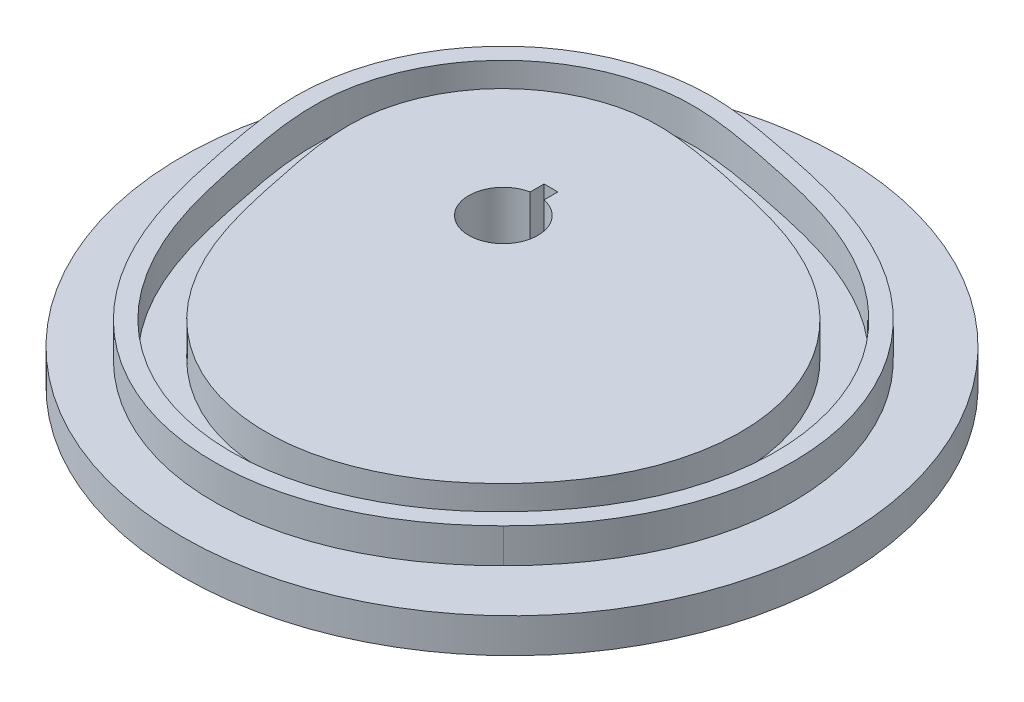
ISO-10303-21;
HEADER;
FILE_DESCRIPTION(('STEP AP214'),'2;1');
FILE_NAME('part.step','',(''),(''),'','','');
FILE_SCHEMA(('AUTOMOTIVE_DESIGN { 1 0 10303 214 1 1 1 1 }'));
ENDSEC;
DATA;
#1=APPLICATION_CONTEXT('core data for automotive mechanical design processes');
#2=APPLICATION_PROTOCOL_DEFINITION('international standard','automotive_design',2000,#1);
#3=PRODUCT_CONTEXT('',#1,'mechanical');
#4=PRODUCT('Part','Part','',(#3));
#5=PRODUCT_RELATED_PRODUCT_CATEGORY('part','',(#4));
#6=PRODUCT_DEFINITION_FORMATION('','',#4);
#7=PRODUCT_DEFINITION_CONTEXT('part definition',#1,'design');
#8=PRODUCT_DEFINITION('design','',#6,#7);
#9=PRODUCT_DEFINITION_SHAPE('','',#8);
#10=(LENGTH_UNIT() NAMED_UNIT(*) SI_UNIT(.MILLI.,.METRE.));
#11=(NAMED_UNIT(*) PLANE_ANGLE_UNIT() SI_UNIT($,.RADIAN.));
#12=(NAMED_UNIT(*) SI_UNIT($,.STERADIAN.) SOLID_ANGLE_UNIT());
#13=UNCERTAINTY_MEASURE_WITH_UNIT(LENGTH_MEASURE(1.E-05),#10,'distance_accuracy_value','');
#14=(GEOMETRIC_REPRESENTATION_CONTEXT(3) GLOBAL_UNCERTAINTY_ASSIGNED_CONTEXT((#13)) GLOBAL_UNIT_ASSIGNED_CONTEXT((#10,
#11,#12)) REPRESENTATION_CONTEXT('',''));
#15=CARTESIAN_POINT('',(0.,0.,0.));
#16=DIRECTION('',(0.,0.,1.));
#17=DIRECTION('',(1.,0.,0.));
#18=AXIS2_PLACEMENT_3D('',#15,#16,#17);
#19=CARTESIAN_POINT('',(-20.7250581944472,1.23780072465941,-19.2641218997697));
#20=DIRECTION('',(0.,-1.,0.));
#21=DIRECTION('',(0.,0.,-1.));
#22=AXIS2_PLACEMENT_3D('',#19,#20,#21);
#23=PLANE('',#22);
#24=CARTESIAN_POINT('',(-55.8573762406504,1.23780072465941,-47.3716739821013));
#25=CARTESIAN_POINT('',(-50.5288172543113,1.23780072465941,-54.0019546783824));
#26=CARTESIAN_POINT('',(-39.6443321368091,1.23780072465941,-61.6033613791305));
#27=CARTESIAN_POINT('',(-22.9455296145728,1.23780072465941,-64.8392255756643));
#28=CARTESIAN_POINT('',(-9.83633978596783,1.23780072465941,-63.4789217485952));
#29=CARTESIAN_POINT('',(3.99333035628244,1.23780072465941,-60.7481343562363));
#30=CARTESIAN_POINT('',(17.4797639447365,1.23780072465941,-57.7770866312036));
#31=CARTESIAN_POINT('',(30.2064835507659,1.23780072465941,-53.4467114583979));
#32=CARTESIAN_POINT('',(45.8009333534226,1.23780072465941,-45.082047008957));
#33=CARTESIAN_POINT('',(61.4665755023162,1.23780072465941,-29.2817178124764));
#34=CARTESIAN_POINT('',(69.8175879457047,1.23780072465941,-3.95976530659119));
#35=CARTESIAN_POINT('',(65.6963112235469,1.23780072465941,22.4072168115759));
#36=CARTESIAN_POINT('',(51.0610645872901,1.23780072465941,44.9503325048824));
#37=CARTESIAN_POINT('',(30.3169713478433,1.23780072465941,62.4762670891359));
#38=CARTESIAN_POINT('',(5.07456873277413,1.23780072465941,71.109606305069));
#39=CARTESIAN_POINT('',(-21.3476862192093,1.23780072465941,67.6188971319587));
#40=CARTESIAN_POINT('',(-43.2874386906402,1.23780072465941,52.4102403065771));
#41=CARTESIAN_POINT('',(-56.9879030358853,1.23780072465941,29.4282106690279));
#42=CARTESIAN_POINT('',(-61.8960006064018,1.23780072465941,7.02769018748866));
#43=CARTESIAN_POINT('',(-65.4801063005527,1.23780072465941,-11.3903444247296));
#44=CARTESIAN_POINT('',(-66.2871270685044,1.23780072465941,-28.4519578977249));
#45=CARTESIAN_POINT('',(-61.1859352269894,1.23780072465941,-40.7413932858202));
#46=CARTESIAN_POINT('',(-55.8573762406504,1.23780072465941,-47.3716739821013));
#47=B_SPLINE_CURVE_WITH_KNOTS('',3,(#24,#25,#26,#27,#28,#29,#30,#31,#32,#33,#34,#35,#36,#37,#38,
#39,#40,#41,#42,#43,#44,#45,#46),.UNSPECIFIED.,.T.,.F.,(4,1,1,1,1,1,1,1,1,1,1,1,1,1,1,1,1,1,1,1,
4),(0.,0.0625,0.09375,0.125,0.15625,0.1875,0.21875,0.25,0.3125,0.375,0.4375,0.5,0.5625,0.625,
0.6875,0.75,0.8125,0.875,0.90625,0.9375,1.),.UNSPECIFIED.);
#48=CARTESIAN_POINT('',(-55.8573762406504,1.23780072465941,-47.3716739821013));
#49=VERTEX_POINT('',#48);
#50=EDGE_CURVE('E175',#49,#49,#47,.T.);
#51=ORIENTED_EDGE('',*,*,#50,.T.);
#52=EDGE_LOOP('',(#51));
#53=FACE_BOUND('',#52,.T.);
#54=CARTESIAN_POINT('',(-63.6672689322955,1.23780072465941,-53.6171184134438));
#55=CARTESIAN_POINT('',(-60.4257884529088,1.23780072465941,-57.6723658103183));
#56=CARTESIAN_POINT('',(-52.7767211049436,1.23780072465941,-64.8578391651479));
#57=CARTESIAN_POINT('',(-38.7870135472323,1.23780072465941,-71.9917081712182));
#58=CARTESIAN_POINT('',(-23.2137298211832,1.23780072465941,-74.9720133366901));
#59=CARTESIAN_POINT('',(-7.95068138166864,1.23780072465941,-73.316095148756));
#60=CARTESIAN_POINT('',(5.90564366087613,1.23780072465941,-70.5591793768284));
#61=CARTESIAN_POINT('',(20.0463135567396,1.23780072465941,-67.4626850518113));
#62=CARTESIAN_POINT('',(34.1494743806365,1.23780072465941,-62.6868463988451));
#63=CARTESIAN_POINT('',(51.9164935761855,1.23780072465941,-53.1800784664138));
#64=CARTESIAN_POINT('',(70.2622313748988,1.23780072465941,-34.7751965527622));
#65=CARTESIAN_POINT('',(80.1834710229369,1.23780072465941,-4.76631506570023));
#66=CARTESIAN_POINT('',(75.2399592505119,1.23780072465941,26.2667730443286));
#67=CARTESIAN_POINT('',(58.5507531607223,1.23780072465941,51.7807343338891));
#68=CARTESIAN_POINT('',(35.6129040861121,1.23780072465941,71.2088752982963));
#69=CARTESIAN_POINT('',(6.18510752586127,1.23780072465941,81.4344301916235));
#70=CARTESIAN_POINT('',(-25.1240364963385,1.23780072465941,77.2900727309106));
#71=CARTESIAN_POINT('',(-50.9268980735882,1.23780072465941,59.3645963471125));
#72=CARTESIAN_POINT('',(-63.9416460527698,1.23780072465941,37.2683933707589));
#73=CARTESIAN_POINT('',(-69.6921720490184,1.23780072465941,18.3701491248002));
#74=CARTESIAN_POINT('',(-72.5906413542653,1.23780072465941,4.312052575006));
#75=CARTESIAN_POINT('',(-75.3784483597329,1.23780072465941,-9.64829344143936));
#76=CARTESIAN_POINT('',(-76.1880827818571,1.23780072465941,-25.2730793720674));
#77=CARTESIAN_POINT('',(-72.2256039812639,1.23780072465941,-40.5263547839013));
#78=CARTESIAN_POINT('',(-66.9087494116822,1.23780072465941,-49.5618710165694));
#79=CARTESIAN_POINT('',(-63.6672689322955,1.23780072465941,-53.6171184134438));
#80=B_SPLINE_CURVE_WITH_KNOTS('',3,(#54,#55,#56,#57,#58,#59,#60,#61,#62,#63,#64,#65,#66,#67,#68,
#69,#70,#71,#72,#73,#74,#75,#76,#77,#78,#79),.UNSPECIFIED.,.T.,.F.,(4,1,1,1,1,1,1,1,1,1,1,1,1,1,
1,1,1,1,1,1,1,1,1,4),(0.,0.03125,0.0625,0.09375,0.125,0.15625,0.1875,0.21875,0.25,0.3125,0.375,
0.4375,0.5,0.5625,0.625,0.6875,0.75,0.8125,0.84375,0.875,0.90625,0.9375,0.96875,1.),.UNSPECIFIED.);
#81=CARTESIAN_POINT('',(-63.6672689322955,1.23780072465941,-53.6171184134438));
#82=VERTEX_POINT('',#81);
#83=EDGE_CURVE('E12',#82,#82,#80,.T.);
#84=ORIENTED_EDGE('',*,*,#83,.F.);
#85=EDGE_LOOP('',(#84));
#86=FACE_BOUND('',#85,.T.);
#87=ADVANCED_FACE('F63',(#53,#86),#23,.F.);
#88=CARTESIAN_POINT('',(3.43251071316246,1.23780072465941,2.37590703520053));
#89=DIRECTION('',(0.,-1.,0.));
#90=DIRECTION('',(0.,0.,-1.));
#91=AXIS2_PLACEMENT_3D('',#88,#89,#90);
#92=CIRCLE('',#91,95.365062458421);
#93=CARTESIAN_POINT('',(3.43251071316246,1.23780072465941,-92.9891554232205));
#94=VERTEX_POINT('',#93);
#95=EDGE_CURVE('E150',#94,#94,#92,.T.);
#96=ORIENTED_EDGE('',*,*,#95,.F.);
#97=EDGE_LOOP('',(#96));
#98=FACE_BOUND('',#97,.T.);
#99=CARTESIAN_POINT('',(-80.7150310303877,1.23780072465941,-19.2636812561735));
#100=CARTESIAN_POINT('',(-80.7148535314178,1.23780072465941,-16.9970446042388));
#101=CARTESIAN_POINT('',(-80.4441279971398,1.23780072465941,-12.3706615965656));
#102=CARTESIAN_POINT('',(-79.2843035170772,1.23780072465941,-3.93414023687667));
#103=CARTESIAN_POINT('',(-77.4061341544626,1.23780072465941,5.80774853981868));
#104=CARTESIAN_POINT('',(-74.9485605393127,1.23780072465941,17.5781580749974));
#105=CARTESIAN_POINT('',(-70.4406813043361,1.23780072465941,33.8329774221332));
#106=CARTESIAN_POINT('',(-60.8712935701828,1.23780072465941,53.8723974444506));
#107=CARTESIAN_POINT('',(-41.5979186980638,1.23780072465941,73.3593792761598));
#108=CARTESIAN_POINT('',(-16.128440046319,1.23780072465941,84.5291520581967));
#109=CARTESIAN_POINT('',(11.6739887647436,1.23780072465941,85.0180298402957));
#110=CARTESIAN_POINT('',(32.9697362791022,1.23780072465941,77.0887083173432));
#111=CARTESIAN_POINT('',(47.5736861128552,1.23780072465941,67.2947859602535));
#112=CARTESIAN_POINT('',(54.0186959682644,1.23780072465941,61.562204852461));
#113=CARTESIAN_POINT('',(57.0729848136639,1.23780072465941,58.5074376105084));
#114=B_SPLINE_CURVE_WITH_KNOTS('',3,(#99,#100,#101,#102,#103,#104,#105,#106,#107,#108,#109,#110,
#111,#112,#113),.UNSPECIFIED.,.F.,.F.,(4,1,1,1,1,1,1,1,1,1,1,1,4),(0.0541157032648678,
0.0809874645350902,0.107859225805313,0.161602748345757,0.215346270886202,0.269089793426647,
0.376576838507537,0.484063883588426,0.591550928669316,0.699037973750205,0.806525018831095,
0.86026854137154,0.914012063911984),.UNSPECIFIED.);
#115=CARTESIAN_POINT('',(-80.7150310303877,1.23780072465941,-19.2636812561736));
#116=VERTEX_POINT('',#115);
#117=CARTESIAN_POINT('',(57.0729848136639,1.23780072465941,58.5074376105084));
#118=VERTEX_POINT('',#117);
#119=EDGE_CURVE('E149',#116,#118,#114,.T.);
#120=ORIENTED_EDGE('',*,*,#119,.F.);
#121=CARTESIAN_POINT('',(-20.7150324194709,1.23780072465941,-19.2644537324842));
#122=DIRECTION('',(0.,1.,0.));
#123=DIRECTION('',(0.,0.,1.));
#124=AXIS2_PLACEMENT_3D('',#121,#122,#123);
#125=CIRCLE('',#124,59.9999986158894);
#126=CARTESIAN_POINT('',(-20.7266995668747,1.23780072465941,-79.2644512140208));
#127=VERTEX_POINT('',#126);
#128=EDGE_CURVE('E85',#127,#116,#125,.T.);
#129=ORIENTED_EDGE('',*,*,#128,.F.);
#130=CARTESIAN_POINT('',(57.0729848136639,1.23780072465941,58.5074376105084));
#131=CARTESIAN_POINT('',(60.1271186952964,1.23780072465941,55.4525155527703));
#132=CARTESIAN_POINT('',(65.8583633113331,1.23780072465941,49.0063175100939));
#133=CARTESIAN_POINT('',(75.6492577840495,1.23780072465941,34.4003373803812));
#134=CARTESIAN_POINT('',(83.57416398284,1.23780072465941,13.1029464213755));
#135=CARTESIAN_POINT('',(83.0795221181748,1.23780072465941,-14.6993804639724));
#136=CARTESIAN_POINT('',(71.9044691310951,1.23780072465941,-40.1665428190488));
#137=CARTESIAN_POINT('',(52.4134918618961,1.23780072465941,-59.4358771635741));
#138=CARTESIAN_POINT('',(32.3720882809908,1.23780072465941,-69.0011100254117));
#139=CARTESIAN_POINT('',(16.1163346625905,1.23780072465941,-73.505619123593));
#140=CARTESIAN_POINT('',(4.3454158559125,1.23780072465941,-75.960752368452));
#141=CARTESIAN_POINT('',(-5.39686213767778,1.23780072465941,-77.8369019371807));
#142=CARTESIAN_POINT('',(-13.8336237076577,1.23780072465941,-78.9949772791908));
#143=CARTESIAN_POINT('',(-18.4600628802186,1.23780072465941,-79.2647436501834));
#144=CARTESIAN_POINT('',(-20.7266995668747,1.23780072465941,-79.2644512140208));
#145=B_SPLINE_CURVE_WITH_KNOTS('',3,(#130,#131,#132,#133,#134,#135,#136,#137,#138,#139,#140,
#141,#142,#143,#144),.UNSPECIFIED.,.F.,.F.,(4,1,1,1,1,1,1,1,1,1,1,1,4),(0.0541157038282967,
0.107859226398935,0.161602748969573,0.26908979411085,0.376576839252127,0.484063884393404,
0.591550929534681,0.699037974675958,0.752781497246596,0.806525019817235,0.860268542387873,
0.887140303673193,0.914012064958512),.UNSPECIFIED.);
#146=EDGE_CURVE('E81',#118,#127,#145,.T.);
#147=ORIENTED_EDGE('',*,*,#146,.F.);
#148=EDGE_LOOP('',(#120,#129,#147));
#149=FACE_BOUND('',#148,.T.);
#150=ADVANCED_FACE('F248',(#98,#149),#23,.F.);
#151=CARTESIAN_POINT('',(-20.7150324194709,11.2378007246594,-19.2644537324842));
#152=DIRECTION('',(0.,-1.,0.));
#153=DIRECTION('',(0.,0.,-1.));
#154=AXIS2_PLACEMENT_3D('',#151,#152,#153);
#155=CYLINDRICAL_SURFACE('',#154,10.);
#156=DIRECTION('',(0.,-1.,0.));
#157=VECTOR('',#156,1.);
#158=CARTESIAN_POINT('',(-18.7250581944472,11.2378007246594,-29.0644538643077));
#159=LINE('',#158,#157);
#160=CARTESIAN_POINT('',(-18.7250581944472,11.2378007246594,-29.0644538643077));
#161=VERTEX_POINT('',#160);
#162=CARTESIAN_POINT('',(-18.7250581944472,-8.76219927534059,-29.0644538643077));
#163=VERTEX_POINT('',#162);
#164=EDGE_CURVE('E199',#161,#163,#159,.T.);
#165=ORIENTED_EDGE('',*,*,#164,.T.);
#166=CARTESIAN_POINT('',(-20.7150324194709,-8.76219927534059,-19.2644537324842));
#167=DIRECTION('',(0.,-1.,0.));
#168=DIRECTION('',(0.,0.,-1.));
#169=AXIS2_PLACEMENT_3D('',#166,#167,#168);
#170=CIRCLE('',#169,10.);
#171=CARTESIAN_POINT('',(-22.7720412281136,-8.76219927534059,-29.050602860776));
#172=VERTEX_POINT('',#171);
#173=EDGE_CURVE('E164',#172,#163,#170,.F.);
#174=ORIENTED_EDGE('',*,*,#173,.F.);
#175=DIRECTION('',(0.,-1.,0.));
#176=VECTOR('',#175,1.);
#177=CARTESIAN_POINT('',(-22.7720412281136,11.2378007246594,-29.050602860776));
#178=LINE('',#177,#176);
#179=CARTESIAN_POINT('',(-22.7720412281136,11.2378007246594,-29.050602860776));
#180=VERTEX_POINT('',#179);
#181=EDGE_CURVE('E74',#180,#172,#178,.T.);
#182=ORIENTED_EDGE('',*,*,#181,.F.);
#183=CARTESIAN_POINT('',(-20.7150324194709,11.2378007246594,-19.2644537324842));
#184=DIRECTION('',(0.,1.,0.));
#185=DIRECTION('',(0.,0.,1.));
#186=AXIS2_PLACEMENT_3D('',#183,#184,#185);
#187=CIRCLE('',#186,10.);
#188=EDGE_CURVE('E182',#180,#161,#187,.T.);
#189=ORIENTED_EDGE('',*,*,#188,.T.);
#190=EDGE_LOOP('',(#165,#174,#182,#189));
#191=FACE_BOUND('',#190,.T.);
#192=ADVANCED_FACE('F221',(#191),#155,.F.);
#193=CARTESIAN_POINT('',(-22.7582269677878,11.2378007246594,-29.053471970831));
#194=DIRECTION('',(-0.20335231448665,0.,-0.979105630763567));
#195=DIRECTION('',(-0.979105630763567,0.,0.203352314486651));
#196=AXIS2_PLACEMENT_3D('',#193,#194,#195);
#197=PLANE('',#196);
#198=ORIENTED_EDGE('',*,*,#181,.T.);
#199=DIRECTION('',(-0.979105630763567,0.,0.20335231448665));
#200=VECTOR('',#199,1.);
#201=CARTESIAN_POINT('',(-22.7582269677878,-8.76219927534059,-29.053471970831));
#202=LINE('',#201,#200);
#203=CARTESIAN_POINT('',(-22.7250581944472,-8.76219927534059,-29.060360856581));
#204=VERTEX_POINT('',#203);
#205=EDGE_CURVE('E161',#204,#172,#202,.T.);
#206=ORIENTED_EDGE('',*,*,#205,.F.);
#207=DIRECTION('',(0.,-1.,0.));
#208=VECTOR('',#207,1.);
#209=CARTESIAN_POINT('',(-22.7250581944472,11.2378007246594,-29.060360856581));
#210=LINE('',#209,#208);
#211=CARTESIAN_POINT('',(-22.7250581944472,11.2378007246594,-29.060360856581));
#212=VERTEX_POINT('',#211);
#213=EDGE_CURVE('E212',#212,#204,#210,.T.);
#214=ORIENTED_EDGE('',*,*,#213,.F.);
#215=DIRECTION('',(0.979105630763567,0.,-0.203352314486651));
#216=VECTOR('',#215,1.);
#217=CARTESIAN_POINT('',(-22.7582269677878,11.2378007246594,-29.053471970831));
#218=LINE('',#217,#216);
#219=EDGE_CURVE('E188',#180,#212,#218,.T.);
#220=ORIENTED_EDGE('',*,*,#219,.F.);
#221=EDGE_LOOP('',(#198,#206,#214,#220));
#222=FACE_BOUND('',#221,.T.);
#223=ADVANCED_FACE('F217',(#222),#197,.F.);
#224=CARTESIAN_POINT('',(-22.7250581944472,11.2378007246594,-19.2641218997697));
#225=DIRECTION('',(-1.,0.,0.));
#226=DIRECTION('',(0.,0.,1.));
#227=AXIS2_PLACEMENT_3D('',#224,#225,#226);
#228=PLANE('',#227);
#229=ORIENTED_EDGE('',*,*,#213,.T.);
#230=DIRECTION('',(0.,0.,1.));
#231=VECTOR('',#230,1.);
#232=CARTESIAN_POINT('',(-22.7250581944472,-8.76219927534059,-19.2641218997697));
#233=LINE('',#232,#231);
#234=CARTESIAN_POINT('',(-22.7250581944472,-8.76219927534059,-33.060360856581));
#235=VERTEX_POINT('',#234);
#236=EDGE_CURVE('E173',#235,#204,#233,.T.);
#237=ORIENTED_EDGE('',*,*,#236,.F.);
#238=DIRECTION('',(0.,-1.,0.));
#239=VECTOR('',#238,1.);
#240=CARTESIAN_POINT('',(-22.7250581944472,11.2378007246594,-33.060360856581));
#241=LINE('',#240,#239);
#242=CARTESIAN_POINT('',(-22.7250581944472,11.2378007246594,-33.060360856581));
#243=VERTEX_POINT('',#242);
#244=EDGE_CURVE('E210',#243,#235,#241,.T.);
#245=ORIENTED_EDGE('',*,*,#244,.F.);
#246=DIRECTION('',(0.,0.,-1.));
#247=VECTOR('',#246,1.);
#248=CARTESIAN_POINT('',(-22.7250581944472,11.2378007246594,-19.2641218997697));
#249=LINE('',#248,#247);
#250=EDGE_CURVE('E191',#212,#243,#249,.T.);
#251=ORIENTED_EDGE('',*,*,#250,.F.);
#252=EDGE_LOOP('',(#229,#237,#245,#251));
#253=FACE_BOUND('',#252,.T.);
#254=ADVANCED_FACE('F229',(#253),#228,.F.);
#255=CARTESIAN_POINT('',(-20.7250581944472,11.2378007246594,-33.060360856581));
#256=DIRECTION('',(0.,0.,-1.));
#257=DIRECTION('',(-1.,0.,0.));
#258=AXIS2_PLACEMENT_3D('',#255,#256,#257);
#259=PLANE('',#258);
#260=ORIENTED_EDGE('',*,*,#244,.T.);
#261=DIRECTION('',(-1.,0.,0.));
#262=VECTOR('',#261,1.);
#263=CARTESIAN_POINT('',(-20.7250581944472,-8.76219927534059,-33.060360856581));
#264=LINE('',#263,#262);
#265=CARTESIAN_POINT('',(-18.7250581944472,-8.76219927534059,-33.060360856581));
#266=VERTEX_POINT('',#265);
#267=EDGE_CURVE('E170',#266,#235,#264,.T.);
#268=ORIENTED_EDGE('',*,*,#267,.F.);
#269=DIRECTION('',(0.,-1.,0.));
#270=VECTOR('',#269,1.);
#271=CARTESIAN_POINT('',(-18.7250581944472,11.2378007246594,-33.060360856581));
#272=LINE('',#271,#270);
#273=CARTESIAN_POINT('',(-18.7250581944472,11.2378007246594,-33.060360856581));
#274=VERTEX_POINT('',#273);
#275=EDGE_CURVE('E208',#274,#266,#272,.T.);
#276=ORIENTED_EDGE('',*,*,#275,.F.);
#277=DIRECTION('',(1.,0.,0.));
#278=VECTOR('',#277,1.);
#279=CARTESIAN_POINT('',(-20.7250581944472,11.2378007246594,-33.060360856581));
#280=LINE('',#279,#278);
#281=EDGE_CURVE('E194',#243,#274,#280,.T.);
#282=ORIENTED_EDGE('',*,*,#281,.F.);
#283=EDGE_LOOP('',(#260,#268,#276,#282));
#284=FACE_BOUND('',#283,.T.);
#285=ADVANCED_FACE('F237',(#284),#259,.F.);
#286=CARTESIAN_POINT('',(-55.8573762406504,11.2378007246594,-47.3716739821013));
#287=CARTESIAN_POINT('',(-50.5288172543113,11.2378007246594,-54.0019546783824));
#288=CARTESIAN_POINT('',(-39.6443321368091,11.2378007246594,-61.6033613791305));
#289=CARTESIAN_POINT('',(-22.9455296145728,11.2378007246594,-64.8392255756643));
#290=CARTESIAN_POINT('',(-9.83633978596783,11.2378007246594,-63.4789217485952));
#291=CARTESIAN_POINT('',(3.99333035628244,11.2378007246594,-60.7481343562363));
#292=CARTESIAN_POINT('',(17.4797639447365,11.2378007246594,-57.7770866312036));
#293=CARTESIAN_POINT('',(30.2064835507659,11.2378007246594,-53.4467114583979));
#294=CARTESIAN_POINT('',(45.8009333534226,11.2378007246594,-45.082047008957));
#295=CARTESIAN_POINT('',(61.4665755023162,11.2378007246594,-29.2817178124764));
#296=CARTESIAN_POINT('',(69.8175879457047,11.2378007246594,-3.95976530659119));
#297=CARTESIAN_POINT('',(65.6963112235469,11.2378007246594,22.4072168115759));
#298=CARTESIAN_POINT('',(51.0610645872901,11.2378007246594,44.9503325048824));
#299=CARTESIAN_POINT('',(30.3169713478433,11.2378007246594,62.4762670891359));
#300=CARTESIAN_POINT('',(5.07456873277413,11.2378007246594,71.109606305069));
#301=CARTESIAN_POINT('',(-21.3476862192093,11.2378007246594,67.6188971319587));
#302=CARTESIAN_POINT('',(-43.2874386906402,11.2378007246594,52.4102403065771));
#303=CARTESIAN_POINT('',(-56.9879030358853,11.2378007246594,29.4282106690279));
#304=CARTESIAN_POINT('',(-61.8960006064018,11.2378007246594,7.02769018748866));
#305=CARTESIAN_POINT('',(-65.4801063005527,11.2378007246594,-11.3903444247296));
#306=CARTESIAN_POINT('',(-66.2871270685044,11.2378007246594,-28.4519578977249));
#307=CARTESIAN_POINT('',(-61.1859352269894,11.2378007246594,-40.7413932858202));
#308=CARTESIAN_POINT('',(-55.8573762406504,11.2378007246594,-47.3716739821013));
#309=B_SPLINE_CURVE_WITH_KNOTS('',3,(#286,#287,#288,#289,#290,#291,#292,#293,#294,#295,#296,
#297,#298,#299,#300,#301,#302,#303,#304,#305,#306,#307,#308),.UNSPECIFIED.,.T.,.F.,(4,1,1,1,1,1,
1,1,1,1,1,1,1,1,1,1,1,1,1,1,4),(0.,0.0625,0.09375,0.125,0.15625,0.1875,0.21875,0.25,0.3125,
0.375,0.4375,0.5,0.5625,0.625,0.6875,0.75,0.8125,0.875,0.90625,0.9375,1.),.UNSPECIFIED.);
#310=DIRECTION('',(0.,-1.,0.));
#311=VECTOR('',#310,1.);
#312=SURFACE_OF_LINEAR_EXTRUSION('',#309,#311);
#313=CARTESIAN_POINT('',(-55.8573762406504,11.2378007246594,-47.3716739821013));
#314=VERTEX_POINT('',#313);
#315=EDGE_CURVE('E176',#314,#314,#309,.T.);
#316=ORIENTED_EDGE('',*,*,#315,.T.);
#317=EDGE_LOOP('',(#316));
#318=FACE_BOUND('',#317,.T.);
#319=ORIENTED_EDGE('',*,*,#50,.F.);
#320=EDGE_LOOP('',(#319));
#321=FACE_BOUND('',#320,.T.);
#322=ADVANCED_FACE('F65',(#318,#321),#312,.T.);
#323=CARTESIAN_POINT('',(-18.7250581944472,11.2378007246594,-19.2641218997697));
#324=DIRECTION('',(-1.,0.,0.));
#325=DIRECTION('',(0.,0.,1.));
#326=AXIS2_PLACEMENT_3D('',#323,#324,#325);
#327=PLANE('',#326);
#328=ORIENTED_EDGE('',*,*,#275,.T.);
#329=DIRECTION('',(0.,0.,-1.));
#330=VECTOR('',#329,1.);
#331=CARTESIAN_POINT('',(-18.7250581944472,-8.76219927534059,-19.2641218997697));
#332=LINE('',#331,#330);
#333=EDGE_CURVE('E167',#163,#266,#332,.T.);
#334=ORIENTED_EDGE('',*,*,#333,.F.);
#335=ORIENTED_EDGE('',*,*,#164,.F.);
#336=DIRECTION('',(0.,0.,-1.));
#337=VECTOR('',#336,1.);
#338=CARTESIAN_POINT('',(-18.7250581944472,11.2378007246594,-19.2641218997697));
#339=LINE('',#338,#337);
#340=EDGE_CURVE('E196',#161,#274,#339,.T.);
#341=ORIENTED_EDGE('',*,*,#340,.T.);
#342=EDGE_LOOP('',(#328,#334,#335,#341));
#343=FACE_BOUND('',#342,.T.);
#344=ADVANCED_FACE('F235',(#343),#327,.T.);
#345=CARTESIAN_POINT('',(-20.7250581944472,11.2378007246594,-19.2641218997697));
#346=DIRECTION('',(0.,1.,0.));
#347=DIRECTION('',(0.,0.,1.));
#348=AXIS2_PLACEMENT_3D('',#345,#346,#347);
#349=PLANE('',#348);
#350=ORIENTED_EDGE('',*,*,#315,.F.);
#351=EDGE_LOOP('',(#350));
#352=FACE_BOUND('',#351,.T.);
#353=ORIENTED_EDGE('',*,*,#188,.F.);
#354=ORIENTED_EDGE('',*,*,#219,.T.);
#355=ORIENTED_EDGE('',*,*,#250,.T.);
#356=ORIENTED_EDGE('',*,*,#281,.T.);
#357=ORIENTED_EDGE('',*,*,#340,.F.);
#358=EDGE_LOOP('',(#353,#354,#355,#356,#357));
#359=FACE_BOUND('',#358,.T.);
#360=ADVANCED_FACE('F231',(#352,#359),#349,.T.);
#361=CARTESIAN_POINT('',(3.43251071316246,-8.76219927534059,2.37590703520053));
#362=DIRECTION('',(0.,1.,0.));
#363=DIRECTION('',(0.,0.,1.));
#364=AXIS2_PLACEMENT_3D('',#361,#362,#363);
#365=CYLINDRICAL_SURFACE('',#364,95.365062458421);
#366=CARTESIAN_POINT('',(3.43251071316246,-8.76219927534059,2.37590703520053));
#367=DIRECTION('',(0.,-1.,0.));
#368=DIRECTION('',(0.,0.,-1.));
#369=AXIS2_PLACEMENT_3D('',#366,#367,#368);
#370=CIRCLE('',#369,95.365062458421);
#371=CARTESIAN_POINT('',(3.43251071316246,-8.76219927534059,-92.9891554232205));
#372=VERTEX_POINT('',#371);
#373=EDGE_CURVE('E153',#372,#372,#370,.T.);
#374=ORIENTED_EDGE('',*,*,#373,.F.);
#375=EDGE_LOOP('',(#374));
#376=FACE_BOUND('',#375,.T.);
#377=ORIENTED_EDGE('',*,*,#95,.T.);
#378=EDGE_LOOP('',(#377));
#379=FACE_BOUND('',#378,.T.);
#380=ADVANCED_FACE('F259',(#376,#379),#365,.T.);
#381=CARTESIAN_POINT('',(-20.7250581944472,-8.76219927534059,-19.2641218997697));
#382=DIRECTION('',(0.,-1.,0.));
#383=DIRECTION('',(0.,0.,-1.));
#384=AXIS2_PLACEMENT_3D('',#381,#382,#383);
#385=PLANE('',#384);
#386=ORIENTED_EDGE('',*,*,#373,.T.);
#387=EDGE_LOOP('',(#386));
#388=FACE_BOUND('',#387,.T.);
#389=ORIENTED_EDGE('',*,*,#205,.T.);
#390=ORIENTED_EDGE('',*,*,#173,.T.);
#391=ORIENTED_EDGE('',*,*,#333,.T.);
#392=ORIENTED_EDGE('',*,*,#267,.T.);
#393=ORIENTED_EDGE('',*,*,#236,.T.);
#394=EDGE_LOOP('',(#389,#390,#391,#392,#393));
#395=FACE_BOUND('',#394,.T.);
#396=ADVANCED_FACE('F224',(#388,#395),#385,.T.);
#397=CARTESIAN_POINT('',(-80.7150310303877,11.2378007246594,-19.2636812561735));
#398=CARTESIAN_POINT('',(-80.7148535314178,11.2378007246594,-16.9970446042388));
#399=CARTESIAN_POINT('',(-80.4441279971398,11.2378007246594,-12.3706615965656));
#400=CARTESIAN_POINT('',(-79.2843035170772,11.2378007246594,-3.93414023687667));
#401=CARTESIAN_POINT('',(-77.4061341544626,11.2378007246594,5.80774853981868));
#402=CARTESIAN_POINT('',(-74.9485605393127,11.2378007246594,17.5781580749974));
#403=CARTESIAN_POINT('',(-70.4406813043361,11.2378007246594,33.8329774221332));
#404=CARTESIAN_POINT('',(-60.8712935701828,11.2378007246594,53.8723974444506));
#405=CARTESIAN_POINT('',(-41.5979186980638,11.2378007246594,73.3593792761598));
#406=CARTESIAN_POINT('',(-16.128440046319,11.2378007246594,84.5291520581967));
#407=CARTESIAN_POINT('',(11.6739887647436,11.2378007246594,85.0180298402957));
#408=CARTESIAN_POINT('',(32.9697362791022,11.2378007246594,77.0887083173432));
#409=CARTESIAN_POINT('',(47.5736861128552,11.2378007246594,67.2947859602535));
#410=CARTESIAN_POINT('',(54.0186959682644,11.2378007246594,61.562204852461));
#411=CARTESIAN_POINT('',(57.0729848136639,11.2378007246594,58.5074376105084));
#412=B_SPLINE_CURVE_WITH_KNOTS('',3,(#397,#398,#399,#400,#401,#402,#403,#404,#405,#406,#407,
#408,#409,#410,#411),.UNSPECIFIED.,.F.,.F.,(4,1,1,1,1,1,1,1,1,1,1,1,4),(0.0541157032648678,
0.0809874645350902,0.107859225805313,0.161602748345757,0.215346270886202,0.269089793426647,
0.376576838507537,0.484063883588426,0.591550928669316,0.699037973750205,0.806525018831095,
0.86026854137154,0.914012063911984),.UNSPECIFIED.);
#413=DIRECTION('',(0.,-1.,0.));
#414=VECTOR('',#413,1.);
#415=SURFACE_OF_LINEAR_EXTRUSION('',#412,#414);
#416=ORIENTED_EDGE('',*,*,#119,.T.);
#417=DIRECTION('',(0.,-1.,0.));
#418=VECTOR('',#417,1.);
#419=CARTESIAN_POINT('',(57.0729848136639,11.2378007246594,58.5074376105084));
#420=LINE('',#419,#418);
#421=CARTESIAN_POINT('',(57.0729848136639,11.2378007246594,58.5074376105084));
#422=VERTEX_POINT('',#421);
#423=EDGE_CURVE('E132',#422,#118,#420,.T.);
#424=ORIENTED_EDGE('',*,*,#423,.F.);
#425=CARTESIAN_POINT('',(-80.7150310303877,11.2378007246594,-19.2636812561736));
#426=VERTEX_POINT('',#425);
#427=EDGE_CURVE('E139',#426,#422,#412,.T.);
#428=ORIENTED_EDGE('',*,*,#427,.F.);
#429=DIRECTION('',(0.,-1.,0.));
#430=VECTOR('',#429,1.);
#431=CARTESIAN_POINT('',(-80.7150310303877,11.2378007246594,-19.2636812561736));
#432=LINE('',#431,#430);
#433=EDGE_CURVE('E155',#426,#116,#432,.T.);
#434=ORIENTED_EDGE('',*,*,#433,.T.);
#435=EDGE_LOOP('',(#416,#424,#428,#434));
#436=FACE_BOUND('',#435,.T.);
#437=ADVANCED_FACE('F148',(#436),#415,.F.);
#438=CARTESIAN_POINT('',(57.0729848136639,11.2378007246594,58.5074376105084));
#439=CARTESIAN_POINT('',(60.1271186952964,11.2378007246594,55.4525155527703));
#440=CARTESIAN_POINT('',(65.8583633113331,11.2378007246594,49.0063175100939));
#441=CARTESIAN_POINT('',(75.6492577840495,11.2378007246594,34.4003373803812));
#442=CARTESIAN_POINT('',(83.57416398284,11.2378007246594,13.1029464213755));
#443=CARTESIAN_POINT('',(83.0795221181748,11.2378007246594,-14.6993804639724));
#444=CARTESIAN_POINT('',(71.9044691310951,11.2378007246594,-40.1665428190488));
#445=CARTESIAN_POINT('',(52.4134918618961,11.2378007246594,-59.4358771635741));
#446=CARTESIAN_POINT('',(32.3720882809908,11.2378007246594,-69.0011100254117));
#447=CARTESIAN_POINT('',(16.1163346625905,11.2378007246594,-73.505619123593));
#448=CARTESIAN_POINT('',(4.3454158559125,11.2378007246594,-75.960752368452));
#449=CARTESIAN_POINT('',(-5.39686213767778,11.2378007246594,-77.8369019371807));
#450=CARTESIAN_POINT('',(-13.8336237076577,11.2378007246594,-78.9949772791908));
#451=CARTESIAN_POINT('',(-18.4600628802186,11.2378007246594,-79.2647436501834));
#452=CARTESIAN_POINT('',(-20.7266995668747,11.2378007246594,-79.2644512140208));
#453=B_SPLINE_CURVE_WITH_KNOTS('',3,(#438,#439,#440,#441,#442,#443,#444,#445,#446,#447,#448,
#449,#450,#451,#452),.UNSPECIFIED.,.F.,.F.,(4,1,1,1,1,1,1,1,1,1,1,1,4),(0.0541157038282967,
0.107859226398935,0.161602748969573,0.26908979411085,0.376576839252127,0.484063884393404,
0.591550929534681,0.699037974675958,0.752781497246596,0.806525019817235,0.860268542387873,
0.887140303673193,0.914012064958512),.UNSPECIFIED.);
#454=DIRECTION('',(0.,-1.,0.));
#455=VECTOR('',#454,1.);
#456=SURFACE_OF_LINEAR_EXTRUSION('',#453,#455);
#457=ORIENTED_EDGE('',*,*,#146,.T.);
#458=DIRECTION('',(0.,-1.,0.));
#459=VECTOR('',#458,1.);
#460=CARTESIAN_POINT('',(-20.7266995668747,11.2378007246594,-79.2644512140208));
#461=LINE('',#460,#459);
#462=CARTESIAN_POINT('',(-20.7266995668747,11.2378007246594,-79.2644512140208));
#463=VERTEX_POINT('',#462);
#464=EDGE_CURVE('E135',#463,#127,#461,.T.);
#465=ORIENTED_EDGE('',*,*,#464,.F.);
#466=EDGE_CURVE('E128',#422,#463,#453,.T.);
#467=ORIENTED_EDGE('',*,*,#466,.F.);
#468=ORIENTED_EDGE('',*,*,#423,.T.);
#469=EDGE_LOOP('',(#457,#465,#467,#468));
#470=FACE_BOUND('',#469,.T.);
#471=ADVANCED_FACE('F130',(#470),#456,.F.);
#472=CARTESIAN_POINT('',(-63.6672689322955,11.2378007246594,-53.6171184134438));
#473=CARTESIAN_POINT('',(-60.4257884529088,11.2378007246594,-57.6723658103183));
#474=CARTESIAN_POINT('',(-52.7767211049436,11.2378007246594,-64.8578391651479));
#475=CARTESIAN_POINT('',(-38.7870135472323,11.2378007246594,-71.9917081712182));
#476=CARTESIAN_POINT('',(-23.2137298211832,11.2378007246594,-74.9720133366901));
#477=CARTESIAN_POINT('',(-7.95068138166864,11.2378007246594,-73.316095148756));
#478=CARTESIAN_POINT('',(5.90564366087613,11.2378007246594,-70.5591793768284));
#479=CARTESIAN_POINT('',(20.0463135567396,11.2378007246594,-67.4626850518113));
#480=CARTESIAN_POINT('',(34.1494743806365,11.2378007246594,-62.6868463988451));
#481=CARTESIAN_POINT('',(51.9164935761855,11.2378007246594,-53.1800784664138));
#482=CARTESIAN_POINT('',(70.2622313748988,11.2378007246594,-34.7751965527622));
#483=CARTESIAN_POINT('',(80.1834710229369,11.2378007246594,-4.76631506570023));
#484=CARTESIAN_POINT('',(75.2399592505119,11.2378007246594,26.2667730443286));
#485=CARTESIAN_POINT('',(58.5507531607223,11.2378007246594,51.7807343338891));
#486=CARTESIAN_POINT('',(35.6129040861121,11.2378007246594,71.2088752982963));
#487=CARTESIAN_POINT('',(6.18510752586127,11.2378007246594,81.4344301916235));
#488=CARTESIAN_POINT('',(-25.1240364963385,11.2378007246594,77.2900727309106));
#489=CARTESIAN_POINT('',(-50.9268980735882,11.2378007246594,59.3645963471125));
#490=CARTESIAN_POINT('',(-63.9416460527698,11.2378007246594,37.2683933707589));
#491=CARTESIAN_POINT('',(-69.6921720490184,11.2378007246594,18.3701491248002));
#492=CARTESIAN_POINT('',(-72.5906413542653,11.2378007246594,4.312052575006));
#493=CARTESIAN_POINT('',(-75.3784483597329,11.2378007246594,-9.64829344143936));
#494=CARTESIAN_POINT('',(-76.1880827818571,11.2378007246594,-25.2730793720674));
#495=CARTESIAN_POINT('',(-72.2256039812639,11.2378007246594,-40.5263547839013));
#496=CARTESIAN_POINT('',(-66.9087494116822,11.2378007246594,-49.5618710165694));
#497=CARTESIAN_POINT('',(-63.6672689322955,11.2378007246594,-53.6171184134438));
#498=B_SPLINE_CURVE_WITH_KNOTS('',3,(#472,#473,#474,#475,#476,#477,#478,#479,#480,#481,#482,
#483,#484,#485,#486,#487,#488,#489,#490,#491,#492,#493,#494,#495,#496,#497),.UNSPECIFIED.,.T.,
.F.,(4,1,1,1,1,1,1,1,1,1,1,1,1,1,1,1,1,1,1,1,1,1,1,4),(0.,0.03125,0.0625,0.09375,0.125,0.15625,
0.1875,0.21875,0.25,0.3125,0.375,0.4375,0.5,0.5625,0.625,0.6875,0.75,0.8125,0.84375,0.875,
0.90625,0.9375,0.96875,1.),.UNSPECIFIED.);
#499=DIRECTION('',(0.,-1.,0.));
#500=VECTOR('',#499,1.);
#501=SURFACE_OF_LINEAR_EXTRUSION('',#498,#500);
#502=CARTESIAN_POINT('',(-63.6672689322955,11.2378007246594,-53.6171184134438));
#503=VERTEX_POINT('',#502);
#504=EDGE_CURVE('E146',#503,#503,#498,.T.);
#505=ORIENTED_EDGE('',*,*,#504,.F.);
#506=EDGE_LOOP('',(#505));
#507=FACE_BOUND('',#506,.T.);
#508=ORIENTED_EDGE('',*,*,#83,.T.);
#509=EDGE_LOOP('',(#508));
#510=FACE_BOUND('',#509,.T.);
#511=ADVANCED_FACE('F297',(#507,#510),#501,.F.);
#512=CARTESIAN_POINT('',(-20.7150324194709,11.2378007246594,-19.2644537324842));
#513=DIRECTION('',(0.,-1.,0.));
#514=DIRECTION('',(0.,0.,-1.));
#515=AXIS2_PLACEMENT_3D('',#512,#513,#514);
#516=CYLINDRICAL_SURFACE('',#515,59.9999986158894);
#517=ORIENTED_EDGE('',*,*,#128,.T.);
#518=ORIENTED_EDGE('',*,*,#433,.F.);
#519=CARTESIAN_POINT('',(-20.7150324194709,11.2378007246594,-19.2644537324842));
#520=DIRECTION('',(0.,1.,0.));
#521=DIRECTION('',(0.,0.,1.));
#522=AXIS2_PLACEMENT_3D('',#519,#520,#521);
#523=CIRCLE('',#522,59.9999986158894);
#524=EDGE_CURVE('E138',#463,#426,#523,.T.);
#525=ORIENTED_EDGE('',*,*,#524,.F.);
#526=ORIENTED_EDGE('',*,*,#464,.T.);
#527=EDGE_LOOP('',(#517,#518,#525,#526));
#528=FACE_BOUND('',#527,.T.);
#529=ADVANCED_FACE('F304',(#528),#516,.T.);
#530=CARTESIAN_POINT('',(-20.7250581944472,11.2378007246594,-19.2641218997697));
#531=DIRECTION('',(0.,1.,0.));
#532=DIRECTION('',(0.,0.,1.));
#533=AXIS2_PLACEMENT_3D('',#530,#531,#532);
#534=PLANE('',#533);
#535=ORIENTED_EDGE('',*,*,#504,.T.);
#536=EDGE_LOOP('',(#535));
#537=FACE_BOUND('',#536,.T.);
#538=ORIENTED_EDGE('',*,*,#427,.T.);
#539=ORIENTED_EDGE('',*,*,#466,.T.);
#540=ORIENTED_EDGE('',*,*,#524,.T.);
#541=EDGE_LOOP('',(#538,#539,#540));
#542=FACE_BOUND('',#541,.T.);
#543=ADVANCED_FACE('F142',(#537,#542),#534,.T.);
#544=CLOSED_SHELL('',(#87,#150,#192,#223,#254,#285,#322,#344,#360,#380,#396,#437,#471,#511,#529,#543));
#545=MANIFOLD_SOLID_BREP('B2',#544);
#546=ADVANCED_BREP_SHAPE_REPRESENTATION('',(#18,#545),#14);
#547=SHAPE_DEFINITION_REPRESENTATION(#9,#546);
ENDSEC;
END-ISO-10303-21;
